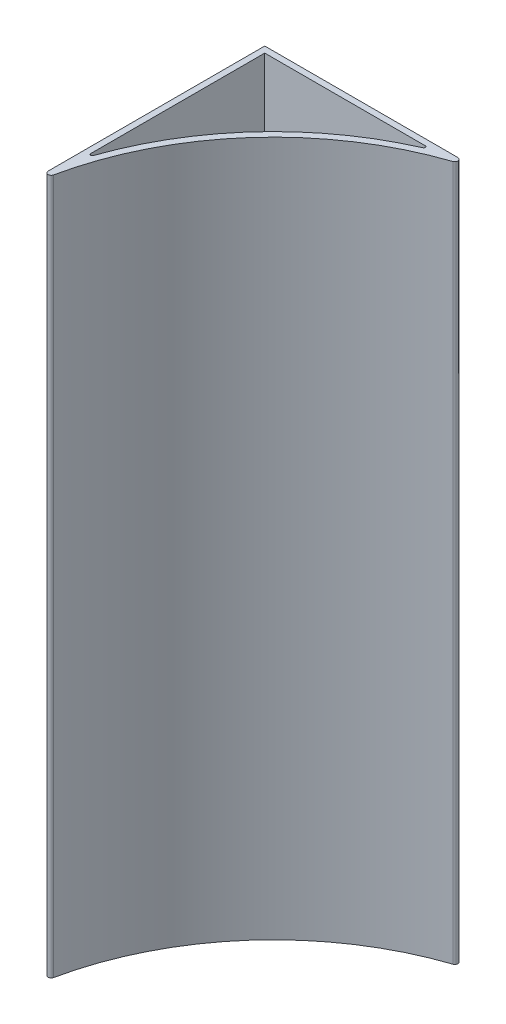
ISO-10303-21;
HEADER;
FILE_DESCRIPTION(('STEP AP214'),'2;1');
FILE_NAME('part.step','',(''),(''),'','','');
FILE_SCHEMA(('AUTOMOTIVE_DESIGN { 1 0 10303 214 1 1 1 1 }'));
ENDSEC;
DATA;
#1=APPLICATION_CONTEXT('core data for automotive mechanical design processes');
#2=APPLICATION_PROTOCOL_DEFINITION('international standard','automotive_design',2000,#1);
#3=PRODUCT_CONTEXT('',#1,'mechanical');
#4=PRODUCT('Part','Part','',(#3));
#5=PRODUCT_RELATED_PRODUCT_CATEGORY('part','',(#4));
#6=PRODUCT_DEFINITION_FORMATION('','',#4);
#7=PRODUCT_DEFINITION_CONTEXT('part definition',#1,'design');
#8=PRODUCT_DEFINITION('design','',#6,#7);
#9=PRODUCT_DEFINITION_SHAPE('','',#8);
#10=(LENGTH_UNIT() NAMED_UNIT(*) SI_UNIT(.MILLI.,.METRE.));
#11=(NAMED_UNIT(*) PLANE_ANGLE_UNIT() SI_UNIT($,.RADIAN.));
#12=(NAMED_UNIT(*) SI_UNIT($,.STERADIAN.) SOLID_ANGLE_UNIT());
#13=UNCERTAINTY_MEASURE_WITH_UNIT(LENGTH_MEASURE(1.E-05),#10,'distance_accuracy_value','');
#14=(GEOMETRIC_REPRESENTATION_CONTEXT(3) GLOBAL_UNCERTAINTY_ASSIGNED_CONTEXT((#13)) GLOBAL_UNIT_ASSIGNED_CONTEXT((#10,
#11,#12)) REPRESENTATION_CONTEXT('',''));
#15=CARTESIAN_POINT('',(0.,0.,0.));
#16=DIRECTION('',(0.,0.,1.));
#17=DIRECTION('',(1.,0.,0.));
#18=AXIS2_PLACEMENT_3D('',#15,#16,#17);
#19=CARTESIAN_POINT('',(-70.,-113.5,0.));
#20=DIRECTION('',(-1.,0.,0.));
#21=DIRECTION('',(0.,0.,1.));
#22=AXIS2_PLACEMENT_3D('',#19,#20,#21);
#23=PLANE('',#22);
#24=DIRECTION('',(0.,1.,0.));
#25=VECTOR('',#24,1.);
#26=CARTESIAN_POINT('',(-70.,-113.5,70.7275177668114));
#27=LINE('',#26,#25);
#28=CARTESIAN_POINT('',(-70.,-113.5,70.7275177668114));
#29=VERTEX_POINT('',#28);
#30=CARTESIAN_POINT('',(-70.,113.5,70.7275177668114));
#31=VERTEX_POINT('',#30);
#32=EDGE_CURVE('E282',#29,#31,#27,.T.);
#33=ORIENTED_EDGE('',*,*,#32,.T.);
#34=DIRECTION('',(0.,0.,1.));
#35=VECTOR('',#34,1.);
#36=CARTESIAN_POINT('',(-70.,113.5,0.));
#37=LINE('',#36,#35);
#38=CARTESIAN_POINT('',(-70.,113.5,0.));
#39=VERTEX_POINT('',#38);
#40=EDGE_CURVE('E227',#39,#31,#37,.T.);
#41=ORIENTED_EDGE('',*,*,#40,.F.);
#42=DIRECTION('',(0.,1.,0.));
#43=VECTOR('',#42,1.);
#44=CARTESIAN_POINT('',(-70.,-113.5,0.));
#45=LINE('',#44,#43);
#46=CARTESIAN_POINT('',(-70.,-113.5,0.));
#47=VERTEX_POINT('',#46);
#48=EDGE_CURVE('E284',#47,#39,#45,.T.);
#49=ORIENTED_EDGE('',*,*,#48,.F.);
#50=DIRECTION('',(0.,0.,1.));
#51=VECTOR('',#50,1.);
#52=CARTESIAN_POINT('',(-70.,-113.5,0.));
#53=LINE('',#52,#51);
#54=EDGE_CURVE('E265',#47,#29,#53,.T.);
#55=ORIENTED_EDGE('',*,*,#54,.T.);
#56=EDGE_LOOP('',(#33,#41,#49,#55));
#57=FACE_BOUND('',#56,.T.);
#58=ADVANCED_FACE('F39',(#57),#23,.T.);
#59=CARTESIAN_POINT('',(-6.94492528092643,-113.5,0.));
#60=DIRECTION('',(0.,0.,-1.));
#61=DIRECTION('',(-1.,0.,0.));
#62=AXIS2_PLACEMENT_3D('',#59,#60,#61);
#63=PLANE('',#62);
#64=DIRECTION('',(0.,-1.,0.));
#65=VECTOR('',#64,1.);
#66=CARTESIAN_POINT('',(-30.0999999999999,69.8,0.));
#67=LINE('',#66,#65);
#68=CARTESIAN_POINT('',(-30.0999999999999,69.8,0.));
#69=VERTEX_POINT('',#68);
#70=CARTESIAN_POINT('',(-30.0999999999999,50.,0.));
#71=VERTEX_POINT('',#70);
#72=EDGE_CURVE('E52',#69,#71,#67,.T.);
#73=ORIENTED_EDGE('',*,*,#72,.F.);
#74=DIRECTION('',(1.,0.,0.));
#75=VECTOR('',#74,1.);
#76=CARTESIAN_POINT('',(-39.8999999999999,69.8,0.));
#77=LINE('',#76,#75);
#78=CARTESIAN_POINT('',(-39.8999999999999,69.8,0.));
#79=VERTEX_POINT('',#78);
#80=EDGE_CURVE('E190',#79,#69,#77,.T.);
#81=ORIENTED_EDGE('',*,*,#80,.F.);
#82=DIRECTION('',(0.,1.,0.));
#83=VECTOR('',#82,1.);
#84=CARTESIAN_POINT('',(-39.8999999999999,69.8,0.));
#85=LINE('',#84,#83);
#86=CARTESIAN_POINT('',(-39.8999999999999,50.,0.));
#87=VERTEX_POINT('',#86);
#88=EDGE_CURVE('E168',#87,#79,#85,.T.);
#89=ORIENTED_EDGE('',*,*,#88,.F.);
#90=DIRECTION('',(-1.,0.,0.));
#91=VECTOR('',#90,1.);
#92=CARTESIAN_POINT('',(-39.8999999999999,50.,0.));
#93=LINE('',#92,#91);
#94=EDGE_CURVE('E176',#71,#87,#93,.T.);
#95=ORIENTED_EDGE('',*,*,#94,.F.);
#96=EDGE_LOOP('',(#73,#81,#89,#95));
#97=FACE_BOUND('',#96,.T.);
#98=DIRECTION('',(0.,1.,0.));
#99=VECTOR('',#98,1.);
#100=CARTESIAN_POINT('',(-39.8999999999999,-69.8,0.));
#101=LINE('',#100,#99);
#102=CARTESIAN_POINT('',(-39.8999999999999,-69.8,0.));
#103=VERTEX_POINT('',#102);
#104=CARTESIAN_POINT('',(-39.8999999999999,-50.,0.));
#105=VERTEX_POINT('',#104);
#106=EDGE_CURVE('E63',#103,#105,#101,.T.);
#107=ORIENTED_EDGE('',*,*,#106,.F.);
#108=DIRECTION('',(-1.,0.,0.));
#109=VECTOR('',#108,1.);
#110=CARTESIAN_POINT('',(-39.8999999999999,-69.8,0.));
#111=LINE('',#110,#109);
#112=CARTESIAN_POINT('',(-30.0999999999999,-69.8,0.));
#113=VERTEX_POINT('',#112);
#114=EDGE_CURVE('E200',#113,#103,#111,.T.);
#115=ORIENTED_EDGE('',*,*,#114,.F.);
#116=DIRECTION('',(0.,-1.,0.));
#117=VECTOR('',#116,1.);
#118=CARTESIAN_POINT('',(-30.0999999999999,-69.8,0.));
#119=LINE('',#118,#117);
#120=CARTESIAN_POINT('',(-30.0999999999999,-50.,0.));
#121=VERTEX_POINT('',#120);
#122=EDGE_CURVE('E208',#121,#113,#119,.T.);
#123=ORIENTED_EDGE('',*,*,#122,.F.);
#124=DIRECTION('',(1.,0.,0.));
#125=VECTOR('',#124,1.);
#126=CARTESIAN_POINT('',(-39.8999999999999,-50.,0.));
#127=LINE('',#126,#125);
#128=EDGE_CURVE('E211',#105,#121,#127,.T.);
#129=ORIENTED_EDGE('',*,*,#128,.F.);
#130=EDGE_LOOP('',(#107,#115,#123,#129));
#131=FACE_BOUND('',#130,.T.);
#132=ORIENTED_EDGE('',*,*,#48,.T.);
#133=DIRECTION('',(-1.,0.,0.));
#134=VECTOR('',#133,1.);
#135=CARTESIAN_POINT('',(-6.94492528092643,113.5,0.));
#136=LINE('',#135,#134);
#137=CARTESIAN_POINT('',(-6.94492528092643,113.5,0.));
#138=VERTEX_POINT('',#137);
#139=EDGE_CURVE('E243',#138,#39,#136,.T.);
#140=ORIENTED_EDGE('',*,*,#139,.F.);
#141=DIRECTION('',(0.,1.,0.));
#142=VECTOR('',#141,1.);
#143=CARTESIAN_POINT('',(-6.94492528092643,-113.5,0.));
#144=LINE('',#143,#142);
#145=CARTESIAN_POINT('',(-6.94492528092643,-113.5,0.));
#146=VERTEX_POINT('',#145);
#147=EDGE_CURVE('E288',#146,#138,#144,.T.);
#148=ORIENTED_EDGE('',*,*,#147,.F.);
#149=DIRECTION('',(-1.,0.,0.));
#150=VECTOR('',#149,1.);
#151=CARTESIAN_POINT('',(-6.94492528092643,-113.5,0.));
#152=LINE('',#151,#150);
#153=EDGE_CURVE('E283',#146,#47,#152,.T.);
#154=ORIENTED_EDGE('',*,*,#153,.T.);
#155=EDGE_LOOP('',(#132,#140,#148,#154));
#156=FACE_BOUND('',#155,.T.);
#157=ADVANCED_FACE('F184',(#97,#131,#156),#63,.T.);
#158=CARTESIAN_POINT('',(-6.94492528092643,-113.5,1.));
#159=DIRECTION('',(0.,1.,0.));
#160=DIRECTION('',(0.,0.,1.));
#161=AXIS2_PLACEMENT_3D('',#158,#159,#160);
#162=CYLINDRICAL_SURFACE('',#161,0.999999999999995);
#163=ORIENTED_EDGE('',*,*,#147,.T.);
#164=CARTESIAN_POINT('',(-6.94492528092643,113.5,1.));
#165=DIRECTION('',(0.,1.,0.));
#166=DIRECTION('',(0.,0.,-1.));
#167=AXIS2_PLACEMENT_3D('',#164,#165,#166);
#168=CIRCLE('',#167,0.999999999999995);
#169=CARTESIAN_POINT('',(-6.62739944079479,113.5,1.94824961948249));
#170=VERTEX_POINT('',#169);
#171=EDGE_CURVE('E236',#170,#138,#168,.T.);
#172=ORIENTED_EDGE('',*,*,#171,.F.);
#173=DIRECTION('',(0.,1.,0.));
#174=VECTOR('',#173,1.);
#175=CARTESIAN_POINT('',(-6.62739944079479,-113.5,1.94824961948249));
#176=LINE('',#175,#174);
#177=CARTESIAN_POINT('',(-6.62739944079479,-113.5,1.94824961948249));
#178=VERTEX_POINT('',#177);
#179=EDGE_CURVE('E286',#178,#170,#176,.T.);
#180=ORIENTED_EDGE('',*,*,#179,.F.);
#181=CARTESIAN_POINT('',(-6.94492528092643,-113.5,1.));
#182=DIRECTION('',(0.,1.,0.));
#183=DIRECTION('',(0.,0.,-1.));
#184=AXIS2_PLACEMENT_3D('',#181,#182,#183);
#185=CIRCLE('',#184,0.999999999999995);
#186=EDGE_CURVE('E279',#178,#146,#185,.T.);
#187=ORIENTED_EDGE('',*,*,#186,.T.);
#188=EDGE_LOOP('',(#163,#172,#180,#187));
#189=FACE_BOUND('',#188,.T.);
#190=ADVANCED_FACE('F333',(#189),#162,.T.);
#191=CARTESIAN_POINT('',(22.8571428571428,-113.5,90.));
#192=DIRECTION('',(0.,1.,0.));
#193=DIRECTION('',(0.,0.,1.));
#194=AXIS2_PLACEMENT_3D('',#191,#192,#193);
#195=CYLINDRICAL_SURFACE('',#194,92.8571428571429);
#196=ORIENTED_EDGE('',*,*,#179,.T.);
#197=CARTESIAN_POINT('',(22.8571428571428,113.5,90.));
#198=DIRECTION('',(0.,-1.,0.));
#199=DIRECTION('',(0.,0.,-1.));
#200=AXIS2_PLACEMENT_3D('',#197,#198,#199);
#201=CIRCLE('',#200,92.8571428571429);
#202=CARTESIAN_POINT('',(-68.0213089802131,113.5,70.9328562380935));
#203=VERTEX_POINT('',#202);
#204=EDGE_CURVE('E231',#203,#170,#201,.T.);
#205=ORIENTED_EDGE('',*,*,#204,.F.);
#206=DIRECTION('',(0.,1.,0.));
#207=VECTOR('',#206,1.);
#208=CARTESIAN_POINT('',(-68.0213089802131,-113.5,70.9328562380935));
#209=LINE('',#208,#207);
#210=CARTESIAN_POINT('',(-68.0213089802131,-113.5,70.9328562380935));
#211=VERTEX_POINT('',#210);
#212=EDGE_CURVE('E295',#211,#203,#209,.T.);
#213=ORIENTED_EDGE('',*,*,#212,.F.);
#214=CARTESIAN_POINT('',(22.8571428571428,-113.5,90.));
#215=DIRECTION('',(0.,-1.,0.));
#216=DIRECTION('',(0.,0.,-1.));
#217=AXIS2_PLACEMENT_3D('',#214,#215,#216);
#218=CIRCLE('',#217,92.8571428571429);
#219=EDGE_CURVE('E274',#211,#178,#218,.T.);
#220=ORIENTED_EDGE('',*,*,#219,.T.);
#221=EDGE_LOOP('',(#196,#205,#213,#220));
#222=FACE_BOUND('',#221,.T.);
#223=ADVANCED_FACE('F357',(#222),#195,.F.);
#224=CARTESIAN_POINT('',(-69.,-113.5,70.7275177668114));
#225=DIRECTION('',(0.,1.,0.));
#226=DIRECTION('',(0.,0.,1.));
#227=AXIS2_PLACEMENT_3D('',#224,#225,#226);
#228=CYLINDRICAL_SURFACE('',#227,0.999999999999987);
#229=ORIENTED_EDGE('',*,*,#212,.T.);
#230=CARTESIAN_POINT('',(-69.,113.5,70.7275177668114));
#231=DIRECTION('',(0.,1.,0.));
#232=DIRECTION('',(0.,0.,1.));
#233=AXIS2_PLACEMENT_3D('',#230,#231,#232);
#234=CIRCLE('',#233,0.999999999999987);
#235=EDGE_CURVE('E235',#31,#203,#234,.T.);
#236=ORIENTED_EDGE('',*,*,#235,.F.);
#237=ORIENTED_EDGE('',*,*,#32,.F.);
#238=CARTESIAN_POINT('',(-69.,-113.5,70.7275177668114));
#239=DIRECTION('',(0.,1.,0.));
#240=DIRECTION('',(0.,0.,1.));
#241=AXIS2_PLACEMENT_3D('',#238,#239,#240);
#242=CIRCLE('',#241,0.999999999999987);
#243=EDGE_CURVE('E275',#29,#211,#242,.T.);
#244=ORIENTED_EDGE('',*,*,#243,.T.);
#245=EDGE_LOOP('',(#229,#236,#237,#244));
#246=FACE_BOUND('',#245,.T.);
#247=ADVANCED_FACE('F345',(#246),#228,.T.);
#248=CARTESIAN_POINT('',(-69.,-113.5,70.7275177668114));
#249=DIRECTION('',(0.,1.,0.));
#250=DIRECTION('',(0.,0.,1.));
#251=AXIS2_PLACEMENT_3D('',#248,#249,#250);
#252=PLANE('',#251);
#253=DIRECTION('',(0.,0.,1.));
#254=VECTOR('',#253,1.);
#255=CARTESIAN_POINT('',(-68.,-113.5,58.8562862548102));
#256=LINE('',#255,#254);
#257=CARTESIAN_POINT('',(-68.,-113.5,2.));
#258=VERTEX_POINT('',#257);
#259=CARTESIAN_POINT('',(-68.,-113.5,58.8562862548102));
#260=VERTEX_POINT('',#259);
#261=EDGE_CURVE('E258',#258,#260,#256,.T.);
#262=ORIENTED_EDGE('',*,*,#261,.T.);
#263=CARTESIAN_POINT('',(-67.5,-113.5,58.8562862548102));
#264=DIRECTION('',(0.,1.,0.));
#265=DIRECTION('',(0.,0.,-1.));
#266=AXIS2_PLACEMENT_3D('',#263,#264,#265);
#267=CIRCLE('',#266,0.500000000000006);
#268=CARTESIAN_POINT('',(-67.0272910679935,-113.5,59.0192165024662));
#269=VERTEX_POINT('',#268);
#270=EDGE_CURVE('E242',#260,#269,#267,.T.);
#271=ORIENTED_EDGE('',*,*,#270,.T.);
#272=CARTESIAN_POINT('',(22.8571428571428,-113.5,90.));
#273=DIRECTION('',(0.,-1.,0.));
#274=DIRECTION('',(0.,0.,1.));
#275=AXIS2_PLACEMENT_3D('',#272,#273,#274);
#276=CIRCLE('',#275,95.0737629851857);
#277=CARTESIAN_POINT('',(-15.3877149007012,-113.5,2.9577616139984));
#278=VERTEX_POINT('',#277);
#279=EDGE_CURVE('E250',#269,#278,#276,.T.);
#280=ORIENTED_EDGE('',*,*,#279,.T.);
#281=CARTESIAN_POINT('',(-15.5888474558722,-113.5,2.49999999999999));
#282=DIRECTION('',(0.,1.,0.));
#283=DIRECTION('',(0.,0.,1.));
#284=AXIS2_PLACEMENT_3D('',#281,#282,#283);
#285=CIRCLE('',#284,0.500000000000001);
#286=CARTESIAN_POINT('',(-15.5888474558722,-113.5,1.99999999999999));
#287=VERTEX_POINT('',#286);
#288=EDGE_CURVE('E246',#278,#287,#285,.T.);
#289=ORIENTED_EDGE('',*,*,#288,.T.);
#290=DIRECTION('',(-1.,0.,0.));
#291=VECTOR('',#290,1.);
#292=CARTESIAN_POINT('',(-68.,-113.5,2.));
#293=LINE('',#292,#291);
#294=EDGE_CURVE('E251',#287,#258,#293,.T.);
#295=ORIENTED_EDGE('',*,*,#294,.T.);
#296=EDGE_LOOP('',(#262,#271,#280,#289,#295));
#297=FACE_BOUND('',#296,.T.);
#298=ORIENTED_EDGE('',*,*,#54,.F.);
#299=ORIENTED_EDGE('',*,*,#153,.F.);
#300=ORIENTED_EDGE('',*,*,#186,.F.);
#301=ORIENTED_EDGE('',*,*,#219,.F.);
#302=ORIENTED_EDGE('',*,*,#243,.F.);
#303=EDGE_LOOP('',(#298,#299,#300,#301,#302));
#304=FACE_BOUND('',#303,.T.);
#305=ADVANCED_FACE('F355',(#297,#304),#252,.F.);
#306=CARTESIAN_POINT('',(-67.5,-113.5,58.8562862548102));
#307=DIRECTION('',(0.,1.,0.));
#308=DIRECTION('',(0.,0.,1.));
#309=AXIS2_PLACEMENT_3D('',#306,#307,#308);
#310=CYLINDRICAL_SURFACE('',#309,0.500000000000006);
#311=DIRECTION('',(0.,1.,0.));
#312=VECTOR('',#311,1.);
#313=CARTESIAN_POINT('',(-68.,-113.5,58.8562862548102));
#314=LINE('',#313,#312);
#315=CARTESIAN_POINT('',(-68.,113.5,58.8562862548102));
#316=VERTEX_POINT('',#315);
#317=EDGE_CURVE('E257',#260,#316,#314,.T.);
#318=ORIENTED_EDGE('',*,*,#317,.T.);
#319=CARTESIAN_POINT('',(-67.5,113.5,58.8562862548102));
#320=DIRECTION('',(0.,1.,0.));
#321=DIRECTION('',(0.,0.,-1.));
#322=AXIS2_PLACEMENT_3D('',#319,#320,#321);
#323=CIRCLE('',#322,0.500000000000006);
#324=CARTESIAN_POINT('',(-67.0272910679935,113.5,59.0192165024662));
#325=VERTEX_POINT('',#324);
#326=EDGE_CURVE('E194',#316,#325,#323,.T.);
#327=ORIENTED_EDGE('',*,*,#326,.T.);
#328=DIRECTION('',(0.,1.,0.));
#329=VECTOR('',#328,1.);
#330=CARTESIAN_POINT('',(-67.0272910679935,-113.5,59.0192165024662));
#331=LINE('',#330,#329);
#332=EDGE_CURVE('E259',#269,#325,#331,.T.);
#333=ORIENTED_EDGE('',*,*,#332,.F.);
#334=ORIENTED_EDGE('',*,*,#270,.F.);
#335=EDGE_LOOP('',(#318,#327,#333,#334));
#336=FACE_BOUND('',#335,.T.);
#337=ADVANCED_FACE('F366',(#336),#310,.F.);
#338=CARTESIAN_POINT('',(-68.,-113.5,58.8562862548102));
#339=DIRECTION('',(-1.,0.,0.));
#340=DIRECTION('',(0.,0.,1.));
#341=AXIS2_PLACEMENT_3D('',#338,#339,#340);
#342=PLANE('',#341);
#343=DIRECTION('',(0.,1.,0.));
#344=VECTOR('',#343,1.);
#345=CARTESIAN_POINT('',(-68.,-113.5,2.));
#346=LINE('',#345,#344);
#347=CARTESIAN_POINT('',(-68.,113.5,2.));
#348=VERTEX_POINT('',#347);
#349=EDGE_CURVE('E263',#258,#348,#346,.T.);
#350=ORIENTED_EDGE('',*,*,#349,.T.);
#351=DIRECTION('',(0.,0.,1.));
#352=VECTOR('',#351,1.);
#353=CARTESIAN_POINT('',(-68.,113.5,58.8562862548102));
#354=LINE('',#353,#352);
#355=EDGE_CURVE('E228',#348,#316,#354,.T.);
#356=ORIENTED_EDGE('',*,*,#355,.T.);
#357=ORIENTED_EDGE('',*,*,#317,.F.);
#358=ORIENTED_EDGE('',*,*,#261,.F.);
#359=EDGE_LOOP('',(#350,#356,#357,#358));
#360=FACE_BOUND('',#359,.T.);
#361=ADVANCED_FACE('F373',(#360),#342,.F.);
#362=CARTESIAN_POINT('',(-68.,-113.5,2.));
#363=DIRECTION('',(0.,0.,-1.));
#364=DIRECTION('',(-1.,0.,0.));
#365=AXIS2_PLACEMENT_3D('',#362,#363,#364);
#366=PLANE('',#365);
#367=DIRECTION('',(1.,0.,0.));
#368=VECTOR('',#367,1.);
#369=CARTESIAN_POINT('',(-68.,69.8,2.));
#370=LINE('',#369,#368);
#371=CARTESIAN_POINT('',(-39.8999999999999,69.8,2.));
#372=VERTEX_POINT('',#371);
#373=CARTESIAN_POINT('',(-30.0999999999999,69.8,1.99999999999999));
#374=VERTEX_POINT('',#373);
#375=EDGE_CURVE('E46',#372,#374,#370,.T.);
#376=ORIENTED_EDGE('',*,*,#375,.T.);
#377=DIRECTION('',(0.,-1.,0.));
#378=VECTOR('',#377,1.);
#379=CARTESIAN_POINT('',(-30.0999999999999,-113.5,1.99999999999999));
#380=LINE('',#379,#378);
#381=CARTESIAN_POINT('',(-30.0999999999999,50.,1.99999999999999));
#382=VERTEX_POINT('',#381);
#383=EDGE_CURVE('E11',#374,#382,#380,.T.);
#384=ORIENTED_EDGE('',*,*,#383,.T.);
#385=DIRECTION('',(-1.,0.,0.));
#386=VECTOR('',#385,1.);
#387=CARTESIAN_POINT('',(-68.,50.,2.));
#388=LINE('',#387,#386);
#389=CARTESIAN_POINT('',(-39.8999999999999,50.,2.));
#390=VERTEX_POINT('',#389);
#391=EDGE_CURVE('E308',#382,#390,#388,.T.);
#392=ORIENTED_EDGE('',*,*,#391,.T.);
#393=DIRECTION('',(0.,1.,0.));
#394=VECTOR('',#393,1.);
#395=CARTESIAN_POINT('',(-39.8999999999999,-113.5,2.));
#396=LINE('',#395,#394);
#397=EDGE_CURVE('E171',#390,#372,#396,.T.);
#398=ORIENTED_EDGE('',*,*,#397,.T.);
#399=EDGE_LOOP('',(#376,#384,#392,#398));
#400=FACE_BOUND('',#399,.T.);
#401=DIRECTION('',(-1.,0.,0.));
#402=VECTOR('',#401,1.);
#403=CARTESIAN_POINT('',(-68.,-69.8,2.));
#404=LINE('',#403,#402);
#405=CARTESIAN_POINT('',(-30.0999999999999,-69.8,1.99999999999999));
#406=VERTEX_POINT('',#405);
#407=CARTESIAN_POINT('',(-39.8999999999999,-69.8,1.99999999999999));
#408=VERTEX_POINT('',#407);
#409=EDGE_CURVE('E299',#406,#408,#404,.T.);
#410=ORIENTED_EDGE('',*,*,#409,.T.);
#411=DIRECTION('',(0.,1.,0.));
#412=VECTOR('',#411,1.);
#413=CARTESIAN_POINT('',(-39.8999999999999,-113.5,2.));
#414=LINE('',#413,#412);
#415=CARTESIAN_POINT('',(-39.8999999999999,-50.,1.99999999999999));
#416=VERTEX_POINT('',#415);
#417=EDGE_CURVE('E303',#408,#416,#414,.T.);
#418=ORIENTED_EDGE('',*,*,#417,.T.);
#419=DIRECTION('',(1.,0.,0.));
#420=VECTOR('',#419,1.);
#421=CARTESIAN_POINT('',(-68.,-50.,2.));
#422=LINE('',#421,#420);
#423=CARTESIAN_POINT('',(-30.0999999999999,-50.,1.99999999999999));
#424=VERTEX_POINT('',#423);
#425=EDGE_CURVE('E290',#416,#424,#422,.T.);
#426=ORIENTED_EDGE('',*,*,#425,.T.);
#427=DIRECTION('',(0.,-1.,0.));
#428=VECTOR('',#427,1.);
#429=CARTESIAN_POINT('',(-30.0999999999999,-113.5,1.99999999999999));
#430=LINE('',#429,#428);
#431=EDGE_CURVE('E300',#424,#406,#430,.T.);
#432=ORIENTED_EDGE('',*,*,#431,.T.);
#433=EDGE_LOOP('',(#410,#418,#426,#432));
#434=FACE_BOUND('',#433,.T.);
#435=DIRECTION('',(0.,1.,0.));
#436=VECTOR('',#435,1.);
#437=CARTESIAN_POINT('',(-15.5888474558722,-113.5,1.99999999999999));
#438=LINE('',#437,#436);
#439=CARTESIAN_POINT('',(-15.5888474558722,113.5,1.99999999999999));
#440=VERTEX_POINT('',#439);
#441=EDGE_CURVE('E264',#287,#440,#438,.T.);
#442=ORIENTED_EDGE('',*,*,#441,.T.);
#443=DIRECTION('',(-1.,0.,0.));
#444=VECTOR('',#443,1.);
#445=CARTESIAN_POINT('',(-68.,113.5,2.));
#446=LINE('',#445,#444);
#447=EDGE_CURVE('E224',#440,#348,#446,.T.);
#448=ORIENTED_EDGE('',*,*,#447,.T.);
#449=ORIENTED_EDGE('',*,*,#349,.F.);
#450=ORIENTED_EDGE('',*,*,#294,.F.);
#451=EDGE_LOOP('',(#442,#448,#449,#450));
#452=FACE_BOUND('',#451,.T.);
#453=ADVANCED_FACE('F309',(#400,#434,#452),#366,.F.);
#454=CARTESIAN_POINT('',(-15.5888474558722,-113.5,2.49999999999999));
#455=DIRECTION('',(0.,1.,0.));
#456=DIRECTION('',(0.,0.,1.));
#457=AXIS2_PLACEMENT_3D('',#454,#455,#456);
#458=CYLINDRICAL_SURFACE('',#457,0.500000000000001);
#459=DIRECTION('',(0.,1.,0.));
#460=VECTOR('',#459,1.);
#461=CARTESIAN_POINT('',(-15.3877149007012,-113.5,2.9577616139984));
#462=LINE('',#461,#460);
#463=CARTESIAN_POINT('',(-15.3877149007012,113.5,2.9577616139984));
#464=VERTEX_POINT('',#463);
#465=EDGE_CURVE('E270',#278,#464,#462,.T.);
#466=ORIENTED_EDGE('',*,*,#465,.T.);
#467=CARTESIAN_POINT('',(-15.5888474558722,113.5,2.49999999999999));
#468=DIRECTION('',(0.,1.,0.));
#469=DIRECTION('',(0.,0.,1.));
#470=AXIS2_PLACEMENT_3D('',#467,#468,#469);
#471=CIRCLE('',#470,0.500000000000001);
#472=EDGE_CURVE('E219',#464,#440,#471,.T.);
#473=ORIENTED_EDGE('',*,*,#472,.T.);
#474=ORIENTED_EDGE('',*,*,#441,.F.);
#475=ORIENTED_EDGE('',*,*,#288,.F.);
#476=EDGE_LOOP('',(#466,#473,#474,#475));
#477=FACE_BOUND('',#476,.T.);
#478=ADVANCED_FACE('F379',(#477),#458,.F.);
#479=CARTESIAN_POINT('',(22.8571428571428,-113.5,90.));
#480=DIRECTION('',(0.,1.,0.));
#481=DIRECTION('',(0.,0.,1.));
#482=AXIS2_PLACEMENT_3D('',#479,#480,#481);
#483=CYLINDRICAL_SURFACE('',#482,95.0737629851857);
#484=ORIENTED_EDGE('',*,*,#332,.T.);
#485=CARTESIAN_POINT('',(22.8571428571428,113.5,90.));
#486=DIRECTION('',(0.,-1.,0.));
#487=DIRECTION('',(0.,0.,1.));
#488=AXIS2_PLACEMENT_3D('',#485,#486,#487);
#489=CIRCLE('',#488,95.0737629851857);
#490=EDGE_CURVE('E220',#325,#464,#489,.T.);
#491=ORIENTED_EDGE('',*,*,#490,.T.);
#492=ORIENTED_EDGE('',*,*,#465,.F.);
#493=ORIENTED_EDGE('',*,*,#279,.F.);
#494=EDGE_LOOP('',(#484,#491,#492,#493));
#495=FACE_BOUND('',#494,.T.);
#496=ADVANCED_FACE('F380',(#495),#483,.T.);
#497=CARTESIAN_POINT('',(-69.,113.5,70.7275177668114));
#498=DIRECTION('',(0.,1.,0.));
#499=DIRECTION('',(0.,0.,1.));
#500=AXIS2_PLACEMENT_3D('',#497,#498,#499);
#501=PLANE('',#500);
#502=ORIENTED_EDGE('',*,*,#40,.T.);
#503=ORIENTED_EDGE('',*,*,#235,.T.);
#504=ORIENTED_EDGE('',*,*,#204,.T.);
#505=ORIENTED_EDGE('',*,*,#171,.T.);
#506=ORIENTED_EDGE('',*,*,#139,.T.);
#507=EDGE_LOOP('',(#502,#503,#504,#505,#506));
#508=FACE_BOUND('',#507,.T.);
#509=ORIENTED_EDGE('',*,*,#490,.F.);
#510=ORIENTED_EDGE('',*,*,#326,.F.);
#511=ORIENTED_EDGE('',*,*,#355,.F.);
#512=ORIENTED_EDGE('',*,*,#447,.F.);
#513=ORIENTED_EDGE('',*,*,#472,.F.);
#514=EDGE_LOOP('',(#509,#510,#511,#512,#513));
#515=FACE_BOUND('',#514,.T.);
#516=ADVANCED_FACE('F341',(#508,#515),#501,.T.);
#517=CARTESIAN_POINT('',(-39.8999999999999,-69.8,5.));
#518=DIRECTION('',(-1.,0.,0.));
#519=DIRECTION('',(0.,0.,1.));
#520=AXIS2_PLACEMENT_3D('',#517,#518,#519);
#521=PLANE('',#520);
#522=DIRECTION('',(0.,0.,-1.));
#523=VECTOR('',#522,1.);
#524=CARTESIAN_POINT('',(-39.8999999999999,-69.8,5.));
#525=LINE('',#524,#523);
#526=EDGE_CURVE('E204',#408,#103,#525,.T.);
#527=ORIENTED_EDGE('',*,*,#526,.T.);
#528=ORIENTED_EDGE('',*,*,#106,.T.);
#529=DIRECTION('',(0.,0.,-1.));
#530=VECTOR('',#529,1.);
#531=CARTESIAN_POINT('',(-39.8999999999999,-50.,5.));
#532=LINE('',#531,#530);
#533=EDGE_CURVE('E197',#416,#105,#532,.T.);
#534=ORIENTED_EDGE('',*,*,#533,.F.);
#535=ORIENTED_EDGE('',*,*,#417,.F.);
#536=EDGE_LOOP('',(#527,#528,#534,#535));
#537=FACE_BOUND('',#536,.T.);
#538=ADVANCED_FACE('F395',(#537),#521,.F.);
#539=CARTESIAN_POINT('',(-39.8999999999999,-69.8,5.));
#540=DIRECTION('',(0.,-1.,0.));
#541=DIRECTION('',(0.,0.,-1.));
#542=AXIS2_PLACEMENT_3D('',#539,#540,#541);
#543=PLANE('',#542);
#544=DIRECTION('',(0.,0.,-1.));
#545=VECTOR('',#544,1.);
#546=CARTESIAN_POINT('',(-30.0999999999999,-69.8,5.));
#547=LINE('',#546,#545);
#548=EDGE_CURVE('E205',#406,#113,#547,.T.);
#549=ORIENTED_EDGE('',*,*,#548,.T.);
#550=ORIENTED_EDGE('',*,*,#114,.T.);
#551=ORIENTED_EDGE('',*,*,#526,.F.);
#552=ORIENTED_EDGE('',*,*,#409,.F.);
#553=EDGE_LOOP('',(#549,#550,#551,#552));
#554=FACE_BOUND('',#553,.T.);
#555=ADVANCED_FACE('F391',(#554),#543,.F.);
#556=CARTESIAN_POINT('',(-30.0999999999999,-69.8,5.));
#557=DIRECTION('',(1.,0.,0.));
#558=DIRECTION('',(0.,0.,-1.));
#559=AXIS2_PLACEMENT_3D('',#556,#557,#558);
#560=PLANE('',#559);
#561=DIRECTION('',(0.,0.,-1.));
#562=VECTOR('',#561,1.);
#563=CARTESIAN_POINT('',(-30.0999999999999,-50.,5.));
#564=LINE('',#563,#562);
#565=EDGE_CURVE('E199',#424,#121,#564,.T.);
#566=ORIENTED_EDGE('',*,*,#565,.T.);
#567=ORIENTED_EDGE('',*,*,#122,.T.);
#568=ORIENTED_EDGE('',*,*,#548,.F.);
#569=ORIENTED_EDGE('',*,*,#431,.F.);
#570=EDGE_LOOP('',(#566,#567,#568,#569));
#571=FACE_BOUND('',#570,.T.);
#572=ADVANCED_FACE('F322',(#571),#560,.F.);
#573=CARTESIAN_POINT('',(-39.8999999999999,-50.,5.));
#574=DIRECTION('',(0.,1.,0.));
#575=DIRECTION('',(0.,0.,1.));
#576=AXIS2_PLACEMENT_3D('',#573,#574,#575);
#577=PLANE('',#576);
#578=ORIENTED_EDGE('',*,*,#533,.T.);
#579=ORIENTED_EDGE('',*,*,#128,.T.);
#580=ORIENTED_EDGE('',*,*,#565,.F.);
#581=ORIENTED_EDGE('',*,*,#425,.F.);
#582=EDGE_LOOP('',(#578,#579,#580,#581));
#583=FACE_BOUND('',#582,.T.);
#584=ADVANCED_FACE('F320',(#583),#577,.F.);
#585=CARTESIAN_POINT('',(-30.0999999999999,69.8,5.));
#586=DIRECTION('',(1.,0.,0.));
#587=DIRECTION('',(0.,0.,-1.));
#588=AXIS2_PLACEMENT_3D('',#585,#586,#587);
#589=PLANE('',#588);
#590=DIRECTION('',(0.,0.,-1.));
#591=VECTOR('',#590,1.);
#592=CARTESIAN_POINT('',(-30.0999999999999,69.8,5.));
#593=LINE('',#592,#591);
#594=EDGE_CURVE('E195',#374,#69,#593,.T.);
#595=ORIENTED_EDGE('',*,*,#594,.T.);
#596=ORIENTED_EDGE('',*,*,#72,.T.);
#597=DIRECTION('',(0.,0.,-1.));
#598=VECTOR('',#597,1.);
#599=CARTESIAN_POINT('',(-30.0999999999999,50.,5.));
#600=LINE('',#599,#598);
#601=EDGE_CURVE('E180',#382,#71,#600,.T.);
#602=ORIENTED_EDGE('',*,*,#601,.F.);
#603=ORIENTED_EDGE('',*,*,#383,.F.);
#604=EDGE_LOOP('',(#595,#596,#602,#603));
#605=FACE_BOUND('',#604,.T.);
#606=ADVANCED_FACE('F312',(#605),#589,.F.);
#607=CARTESIAN_POINT('',(-39.8999999999999,69.8,5.));
#608=DIRECTION('',(0.,1.,0.));
#609=DIRECTION('',(0.,0.,1.));
#610=AXIS2_PLACEMENT_3D('',#607,#608,#609);
#611=PLANE('',#610);
#612=DIRECTION('',(0.,0.,-1.));
#613=VECTOR('',#612,1.);
#614=CARTESIAN_POINT('',(-39.8999999999999,69.8,5.));
#615=LINE('',#614,#613);
#616=EDGE_CURVE('E177',#372,#79,#615,.T.);
#617=ORIENTED_EDGE('',*,*,#616,.T.);
#618=ORIENTED_EDGE('',*,*,#80,.T.);
#619=ORIENTED_EDGE('',*,*,#594,.F.);
#620=ORIENTED_EDGE('',*,*,#375,.F.);
#621=EDGE_LOOP('',(#617,#618,#619,#620));
#622=FACE_BOUND('',#621,.T.);
#623=ADVANCED_FACE('F314',(#622),#611,.F.);
#624=CARTESIAN_POINT('',(-39.8999999999999,69.8,5.));
#625=DIRECTION('',(-1.,0.,0.));
#626=DIRECTION('',(0.,0.,1.));
#627=AXIS2_PLACEMENT_3D('',#624,#625,#626);
#628=PLANE('',#627);
#629=DIRECTION('',(0.,0.,-1.));
#630=VECTOR('',#629,1.);
#631=CARTESIAN_POINT('',(-39.8999999999999,50.,5.));
#632=LINE('',#631,#630);
#633=EDGE_CURVE('E164',#390,#87,#632,.T.);
#634=ORIENTED_EDGE('',*,*,#633,.T.);
#635=ORIENTED_EDGE('',*,*,#88,.T.);
#636=ORIENTED_EDGE('',*,*,#616,.F.);
#637=ORIENTED_EDGE('',*,*,#397,.F.);
#638=EDGE_LOOP('',(#634,#635,#636,#637));
#639=FACE_BOUND('',#638,.T.);
#640=ADVANCED_FACE('F170',(#639),#628,.F.);
#641=CARTESIAN_POINT('',(-39.8999999999999,50.,5.));
#642=DIRECTION('',(0.,-1.,0.));
#643=DIRECTION('',(0.,0.,-1.));
#644=AXIS2_PLACEMENT_3D('',#641,#642,#643);
#645=PLANE('',#644);
#646=ORIENTED_EDGE('',*,*,#601,.T.);
#647=ORIENTED_EDGE('',*,*,#94,.T.);
#648=ORIENTED_EDGE('',*,*,#633,.F.);
#649=ORIENTED_EDGE('',*,*,#391,.F.);
#650=EDGE_LOOP('',(#646,#647,#648,#649));
#651=FACE_BOUND('',#650,.T.);
#652=ADVANCED_FACE('F182',(#651),#645,.F.);
#653=CLOSED_SHELL('',(#58,#157,#190,#223,#247,#305,#337,#361,#453,#478,#496,#516,#538,#555,#572,
#584,#606,#623,#640,#652));
#654=MANIFOLD_SOLID_BREP('B2',#653);
#655=ADVANCED_BREP_SHAPE_REPRESENTATION('',(#18,#654),#14);
#656=SHAPE_DEFINITION_REPRESENTATION(#9,#655);
ENDSEC;
END-ISO-10303-21;
